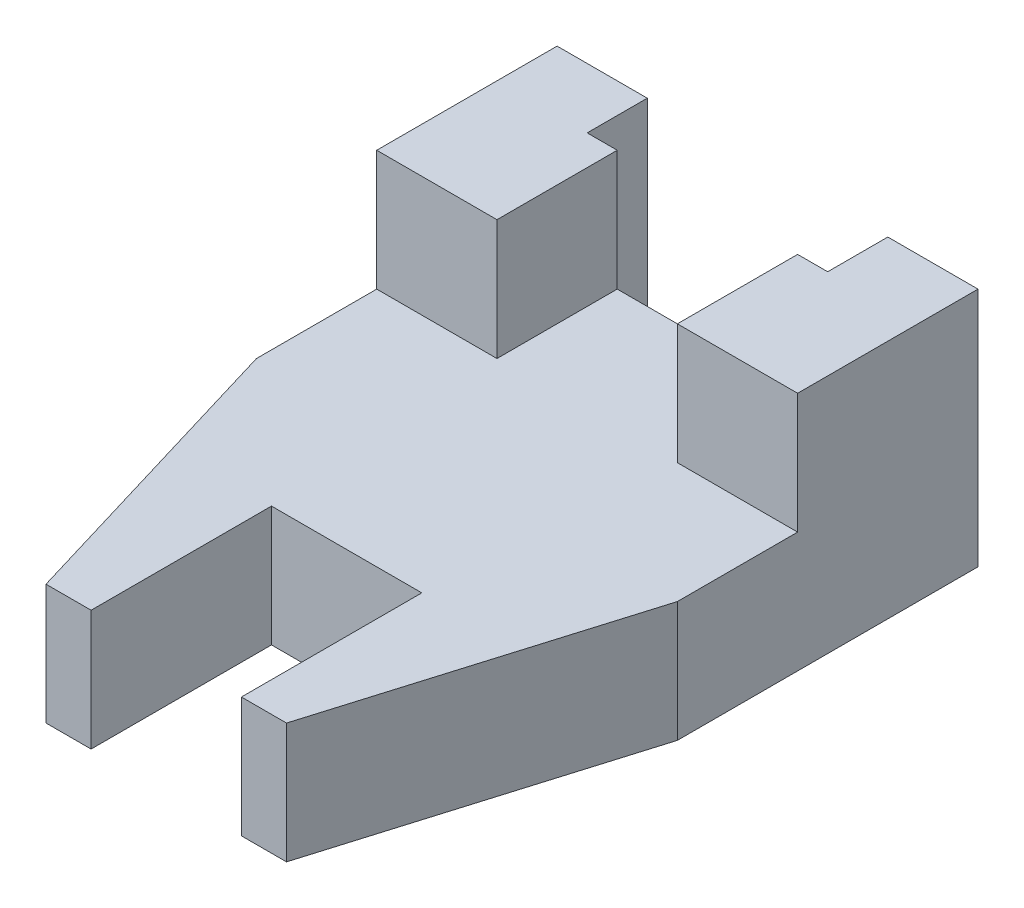
ISO-10303-21;
HEADER;
FILE_DESCRIPTION(('STEP AP214'),'2;1');
FILE_NAME('part.step','',(''),(''),'','','');
FILE_SCHEMA(('AUTOMOTIVE_DESIGN { 1 0 10303 214 1 1 1 1 }'));
ENDSEC;
DATA;
#1=APPLICATION_CONTEXT('core data for automotive mechanical design processes');
#2=APPLICATION_PROTOCOL_DEFINITION('international standard','automotive_design',2000,#1);
#3=PRODUCT_CONTEXT('',#1,'mechanical');
#4=PRODUCT('Part','Part','',(#3));
#5=PRODUCT_RELATED_PRODUCT_CATEGORY('part','',(#4));
#6=PRODUCT_DEFINITION_FORMATION('','',#4);
#7=PRODUCT_DEFINITION_CONTEXT('part definition',#1,'design');
#8=PRODUCT_DEFINITION('design','',#6,#7);
#9=PRODUCT_DEFINITION_SHAPE('','',#8);
#10=(LENGTH_UNIT() NAMED_UNIT(*) SI_UNIT(.MILLI.,.METRE.));
#11=(NAMED_UNIT(*) PLANE_ANGLE_UNIT() SI_UNIT($,.RADIAN.));
#12=(NAMED_UNIT(*) SI_UNIT($,.STERADIAN.) SOLID_ANGLE_UNIT());
#13=UNCERTAINTY_MEASURE_WITH_UNIT(LENGTH_MEASURE(1.E-05),#10,'distance_accuracy_value','');
#14=(GEOMETRIC_REPRESENTATION_CONTEXT(3) GLOBAL_UNCERTAINTY_ASSIGNED_CONTEXT((#13)) GLOBAL_UNIT_ASSIGNED_CONTEXT((#10,
#11,#12)) REPRESENTATION_CONTEXT('',''));
#15=CARTESIAN_POINT('',(0.,0.,0.));
#16=DIRECTION('',(0.,0.,1.));
#17=DIRECTION('',(1.,0.,0.));
#18=AXIS2_PLACEMENT_3D('',#15,#16,#17);
#19=CARTESIAN_POINT('',(0.,20.,70.));
#20=DIRECTION('',(0.,0.,1.));
#21=DIRECTION('',(1.,0.,0.));
#22=AXIS2_PLACEMENT_3D('',#19,#20,#21);
#23=PLANE('',#22);
#24=DIRECTION('',(-1.,0.,0.));
#25=VECTOR('',#24,1.);
#26=CARTESIAN_POINT('',(0.,0.,70.));
#27=LINE('',#26,#25);
#28=CARTESIAN_POINT('',(47.5,0.,70.));
#29=VERTEX_POINT('',#28);
#30=CARTESIAN_POINT('',(22.5,0.,70.));
#31=VERTEX_POINT('',#30);
#32=EDGE_CURVE('E272',#29,#31,#27,.T.);
#33=ORIENTED_EDGE('',*,*,#32,.F.);
#34=DIRECTION('',(0.,-1.,0.));
#35=VECTOR('',#34,1.);
#36=CARTESIAN_POINT('',(47.5,20.,70.));
#37=LINE('',#36,#35);
#38=CARTESIAN_POINT('',(47.5,20.,70.));
#39=VERTEX_POINT('',#38);
#40=EDGE_CURVE('E11',#39,#29,#37,.T.);
#41=ORIENTED_EDGE('',*,*,#40,.F.);
#42=DIRECTION('',(-1.,0.,0.));
#43=VECTOR('',#42,1.);
#44=CARTESIAN_POINT('',(0.,20.,70.));
#45=LINE('',#44,#43);
#46=CARTESIAN_POINT('',(22.5,20.,70.));
#47=VERTEX_POINT('',#46);
#48=EDGE_CURVE('E273',#39,#47,#45,.T.);
#49=ORIENTED_EDGE('',*,*,#48,.T.);
#50=DIRECTION('',(0.,-1.,0.));
#51=VECTOR('',#50,1.);
#52=CARTESIAN_POINT('',(22.5,20.,70.));
#53=LINE('',#52,#51);
#54=EDGE_CURVE('E311',#47,#31,#53,.T.);
#55=ORIENTED_EDGE('',*,*,#54,.T.);
#56=EDGE_LOOP('',(#33,#41,#49,#55));
#57=FACE_BOUND('',#56,.T.);
#58=ADVANCED_FACE('F45',(#57),#23,.T.);
#59=CARTESIAN_POINT('',(47.5,20.,0.));
#60=DIRECTION('',(-1.,0.,0.));
#61=DIRECTION('',(0.,0.,1.));
#62=AXIS2_PLACEMENT_3D('',#59,#60,#61);
#63=PLANE('',#62);
#64=DIRECTION('',(0.,0.,-1.));
#65=VECTOR('',#64,1.);
#66=CARTESIAN_POINT('',(47.5,0.,0.));
#67=LINE('',#66,#65);
#68=CARTESIAN_POINT('',(47.5,0.,100.));
#69=VERTEX_POINT('',#68);
#70=EDGE_CURVE('E315',#69,#29,#67,.T.);
#71=ORIENTED_EDGE('',*,*,#70,.F.);
#72=DIRECTION('',(0.,-1.,0.));
#73=VECTOR('',#72,1.);
#74=CARTESIAN_POINT('',(47.5,20.,100.));
#75=LINE('',#74,#73);
#76=CARTESIAN_POINT('',(47.5,20.,100.));
#77=VERTEX_POINT('',#76);
#78=EDGE_CURVE('E53',#77,#69,#75,.T.);
#79=ORIENTED_EDGE('',*,*,#78,.F.);
#80=DIRECTION('',(0.,0.,-1.));
#81=VECTOR('',#80,1.);
#82=CARTESIAN_POINT('',(47.5,20.,0.));
#83=LINE('',#82,#81);
#84=EDGE_CURVE('E277',#77,#39,#83,.T.);
#85=ORIENTED_EDGE('',*,*,#84,.T.);
#86=ORIENTED_EDGE('',*,*,#40,.T.);
#87=EDGE_LOOP('',(#71,#79,#85,#86));
#88=FACE_BOUND('',#87,.T.);
#89=ADVANCED_FACE('F368',(#88),#63,.T.);
#90=CARTESIAN_POINT('',(0.,20.,100.));
#91=DIRECTION('',(0.,0.,1.));
#92=DIRECTION('',(1.,0.,0.));
#93=AXIS2_PLACEMENT_3D('',#90,#91,#92);
#94=PLANE('',#93);
#95=DIRECTION('',(-1.,0.,0.));
#96=VECTOR('',#95,1.);
#97=CARTESIAN_POINT('',(0.,0.,100.));
#98=LINE('',#97,#96);
#99=CARTESIAN_POINT('',(55.,0.,100.));
#100=VERTEX_POINT('',#99);
#101=EDGE_CURVE('E319',#100,#69,#98,.T.);
#102=ORIENTED_EDGE('',*,*,#101,.F.);
#103=DIRECTION('',(0.,-1.,0.));
#104=VECTOR('',#103,1.);
#105=CARTESIAN_POINT('',(55.,20.,100.));
#106=LINE('',#105,#104);
#107=CARTESIAN_POINT('',(55.,20.,100.));
#108=VERTEX_POINT('',#107);
#109=EDGE_CURVE('E358',#108,#100,#106,.T.);
#110=ORIENTED_EDGE('',*,*,#109,.F.);
#111=DIRECTION('',(-1.,0.,0.));
#112=VECTOR('',#111,1.);
#113=CARTESIAN_POINT('',(0.,20.,100.));
#114=LINE('',#113,#112);
#115=EDGE_CURVE('E282',#108,#77,#114,.T.);
#116=ORIENTED_EDGE('',*,*,#115,.T.);
#117=ORIENTED_EDGE('',*,*,#78,.T.);
#118=EDGE_LOOP('',(#102,#110,#116,#117));
#119=FACE_BOUND('',#118,.T.);
#120=ADVANCED_FACE('F364',(#119),#94,.T.);
#121=CARTESIAN_POINT('',(77.9816513761468,20.,23.394495412844));
#122=DIRECTION('',(0.957826285221151,0.,0.287347885566345));
#123=DIRECTION('',(0.287347885566345,0.,-0.957826285221151));
#124=AXIS2_PLACEMENT_3D('',#121,#122,#123);
#125=PLANE('',#124);
#126=DIRECTION('',(-0.287347885566345,0.,0.957826285221151));
#127=VECTOR('',#126,1.);
#128=CARTESIAN_POINT('',(77.9816513761468,0.,23.394495412844));
#129=LINE('',#128,#127);
#130=CARTESIAN_POINT('',(70.,0.,50.));
#131=VERTEX_POINT('',#130);
#132=EDGE_CURVE('E323',#131,#100,#129,.T.);
#133=ORIENTED_EDGE('',*,*,#132,.F.);
#134=DIRECTION('',(0.,-1.,0.));
#135=VECTOR('',#134,1.);
#136=CARTESIAN_POINT('',(70.,20.,50.));
#137=LINE('',#136,#135);
#138=CARTESIAN_POINT('',(70.,20.,50.));
#139=VERTEX_POINT('',#138);
#140=EDGE_CURVE('E355',#139,#131,#137,.T.);
#141=ORIENTED_EDGE('',*,*,#140,.F.);
#142=DIRECTION('',(-0.287347885566345,0.,0.957826285221151));
#143=VECTOR('',#142,1.);
#144=CARTESIAN_POINT('',(77.9816513761468,20.,23.394495412844));
#145=LINE('',#144,#143);
#146=EDGE_CURVE('E286',#139,#108,#145,.T.);
#147=ORIENTED_EDGE('',*,*,#146,.T.);
#148=ORIENTED_EDGE('',*,*,#109,.T.);
#149=EDGE_LOOP('',(#133,#141,#147,#148));
#150=FACE_BOUND('',#149,.T.);
#151=ADVANCED_FACE('F374',(#150),#125,.T.);
#152=CARTESIAN_POINT('',(70.,20.,0.));
#153=DIRECTION('',(1.,0.,0.));
#154=DIRECTION('',(0.,0.,-1.));
#155=AXIS2_PLACEMENT_3D('',#152,#153,#154);
#156=PLANE('',#155);
#157=DIRECTION('',(0.,0.,1.));
#158=VECTOR('',#157,1.);
#159=CARTESIAN_POINT('',(70.,0.,0.));
#160=LINE('',#159,#158);
#161=CARTESIAN_POINT('',(70.,0.,0.));
#162=VERTEX_POINT('',#161);
#163=EDGE_CURVE('E208',#162,#131,#160,.T.);
#164=ORIENTED_EDGE('',*,*,#163,.F.);
#165=DIRECTION('',(0.,-1.,0.));
#166=VECTOR('',#165,1.);
#167=CARTESIAN_POINT('',(70.,40.,0.));
#168=LINE('',#167,#166);
#169=CARTESIAN_POINT('',(70.,40.,0.));
#170=VERTEX_POINT('',#169);
#171=EDGE_CURVE('E187',#170,#162,#168,.T.);
#172=ORIENTED_EDGE('',*,*,#171,.F.);
#173=DIRECTION('',(0.,0.,-1.));
#174=VECTOR('',#173,1.);
#175=CARTESIAN_POINT('',(70.,40.,0.));
#176=LINE('',#175,#174);
#177=CARTESIAN_POINT('',(70.,40.,30.));
#178=VERTEX_POINT('',#177);
#179=EDGE_CURVE('E194',#178,#170,#176,.T.);
#180=ORIENTED_EDGE('',*,*,#179,.F.);
#181=DIRECTION('',(0.,-1.,0.));
#182=VECTOR('',#181,1.);
#183=CARTESIAN_POINT('',(70.,40.,30.));
#184=LINE('',#183,#182);
#185=CARTESIAN_POINT('',(70.,20.,30.));
#186=VERTEX_POINT('',#185);
#187=EDGE_CURVE('E429',#178,#186,#184,.T.);
#188=ORIENTED_EDGE('',*,*,#187,.T.);
#189=DIRECTION('',(0.,0.,1.));
#190=VECTOR('',#189,1.);
#191=CARTESIAN_POINT('',(70.,20.,0.));
#192=LINE('',#191,#190);
#193=EDGE_CURVE('E290',#186,#139,#192,.T.);
#194=ORIENTED_EDGE('',*,*,#193,.T.);
#195=ORIENTED_EDGE('',*,*,#140,.T.);
#196=EDGE_LOOP('',(#164,#172,#180,#188,#194,#195));
#197=FACE_BOUND('',#196,.T.);
#198=ADVANCED_FACE('F206',(#197),#156,.T.);
#199=CARTESIAN_POINT('',(0.,20.,0.));
#200=DIRECTION('',(1.,0.,0.));
#201=DIRECTION('',(0.,0.,-1.));
#202=AXIS2_PLACEMENT_3D('',#199,#200,#201);
#203=PLANE('',#202);
#204=DIRECTION('',(0.,0.,1.));
#205=VECTOR('',#204,1.);
#206=CARTESIAN_POINT('',(0.,0.,0.));
#207=LINE('',#206,#205);
#208=CARTESIAN_POINT('',(0.,0.,0.));
#209=VERTEX_POINT('',#208);
#210=CARTESIAN_POINT('',(0.,0.,50.));
#211=VERTEX_POINT('',#210);
#212=EDGE_CURVE('E329',#209,#211,#207,.T.);
#213=ORIENTED_EDGE('',*,*,#212,.T.);
#214=DIRECTION('',(0.,-1.,0.));
#215=VECTOR('',#214,1.);
#216=CARTESIAN_POINT('',(0.,20.,50.));
#217=LINE('',#216,#215);
#218=CARTESIAN_POINT('',(0.,20.,50.));
#219=VERTEX_POINT('',#218);
#220=EDGE_CURVE('E351',#219,#211,#217,.T.);
#221=ORIENTED_EDGE('',*,*,#220,.F.);
#222=DIRECTION('',(0.,0.,1.));
#223=VECTOR('',#222,1.);
#224=CARTESIAN_POINT('',(0.,20.,0.));
#225=LINE('',#224,#223);
#226=CARTESIAN_POINT('',(0.,20.,30.));
#227=VERTEX_POINT('',#226);
#228=EDGE_CURVE('E299',#227,#219,#225,.T.);
#229=ORIENTED_EDGE('',*,*,#228,.F.);
#230=DIRECTION('',(0.,-1.,0.));
#231=VECTOR('',#230,1.);
#232=CARTESIAN_POINT('',(0.,40.,30.));
#233=LINE('',#232,#231);
#234=CARTESIAN_POINT('',(0.,40.,30.));
#235=VERTEX_POINT('',#234);
#236=EDGE_CURVE('E268',#235,#227,#233,.T.);
#237=ORIENTED_EDGE('',*,*,#236,.F.);
#238=DIRECTION('',(0.,0.,-1.));
#239=VECTOR('',#238,1.);
#240=CARTESIAN_POINT('',(0.,40.,0.));
#241=LINE('',#240,#239);
#242=CARTESIAN_POINT('',(0.,40.,0.));
#243=VERTEX_POINT('',#242);
#244=EDGE_CURVE('E221',#235,#243,#241,.T.);
#245=ORIENTED_EDGE('',*,*,#244,.T.);
#246=DIRECTION('',(0.,-1.,0.));
#247=VECTOR('',#246,1.);
#248=CARTESIAN_POINT('',(0.,40.,0.));
#249=LINE('',#248,#247);
#250=EDGE_CURVE('E245',#243,#209,#249,.T.);
#251=ORIENTED_EDGE('',*,*,#250,.T.);
#252=EDGE_LOOP('',(#213,#221,#229,#237,#245,#251));
#253=FACE_BOUND('',#252,.T.);
#254=ADVANCED_FACE('F398',(#253),#203,.F.);
#255=CARTESIAN_POINT('',(-13.7614678899083,20.,4.12844036697249));
#256=DIRECTION('',(0.957826285221151,0.,-0.287347885566346));
#257=DIRECTION('',(-0.287347885566346,0.,-0.957826285221151));
#258=AXIS2_PLACEMENT_3D('',#255,#256,#257);
#259=PLANE('',#258);
#260=DIRECTION('',(0.287347885566346,0.,0.957826285221151));
#261=VECTOR('',#260,1.);
#262=CARTESIAN_POINT('',(-13.7614678899083,0.,4.12844036697249));
#263=LINE('',#262,#261);
#264=CARTESIAN_POINT('',(15.,0.,100.));
#265=VERTEX_POINT('',#264);
#266=EDGE_CURVE('E332',#211,#265,#263,.T.);
#267=ORIENTED_EDGE('',*,*,#266,.T.);
#268=DIRECTION('',(0.,-1.,0.));
#269=VECTOR('',#268,1.);
#270=CARTESIAN_POINT('',(15.,20.,100.));
#271=LINE('',#270,#269);
#272=CARTESIAN_POINT('',(15.,20.,100.));
#273=VERTEX_POINT('',#272);
#274=EDGE_CURVE('E347',#273,#265,#271,.T.);
#275=ORIENTED_EDGE('',*,*,#274,.F.);
#276=DIRECTION('',(0.287347885566346,0.,0.957826285221151));
#277=VECTOR('',#276,1.);
#278=CARTESIAN_POINT('',(-13.7614678899083,20.,4.12844036697249));
#279=LINE('',#278,#277);
#280=EDGE_CURVE('E302',#219,#273,#279,.T.);
#281=ORIENTED_EDGE('',*,*,#280,.F.);
#282=ORIENTED_EDGE('',*,*,#220,.T.);
#283=EDGE_LOOP('',(#267,#275,#281,#282));
#284=FACE_BOUND('',#283,.T.);
#285=ADVANCED_FACE('F394',(#284),#259,.F.);
#286=CARTESIAN_POINT('',(0.,20.,100.));
#287=DIRECTION('',(0.,0.,-1.));
#288=DIRECTION('',(-1.,0.,0.));
#289=AXIS2_PLACEMENT_3D('',#286,#287,#288);
#290=PLANE('',#289);
#291=DIRECTION('',(1.,0.,0.));
#292=VECTOR('',#291,1.);
#293=CARTESIAN_POINT('',(0.,0.,100.));
#294=LINE('',#293,#292);
#295=CARTESIAN_POINT('',(22.5,0.,100.));
#296=VERTEX_POINT('',#295);
#297=EDGE_CURVE('E335',#265,#296,#294,.T.);
#298=ORIENTED_EDGE('',*,*,#297,.T.);
#299=DIRECTION('',(0.,-1.,0.));
#300=VECTOR('',#299,1.);
#301=CARTESIAN_POINT('',(22.5,20.,100.));
#302=LINE('',#301,#300);
#303=CARTESIAN_POINT('',(22.5,20.,100.));
#304=VERTEX_POINT('',#303);
#305=EDGE_CURVE('E343',#304,#296,#302,.T.);
#306=ORIENTED_EDGE('',*,*,#305,.F.);
#307=DIRECTION('',(1.,0.,0.));
#308=VECTOR('',#307,1.);
#309=CARTESIAN_POINT('',(0.,20.,100.));
#310=LINE('',#309,#308);
#311=EDGE_CURVE('E305',#273,#304,#310,.T.);
#312=ORIENTED_EDGE('',*,*,#311,.F.);
#313=ORIENTED_EDGE('',*,*,#274,.T.);
#314=EDGE_LOOP('',(#298,#306,#312,#313));
#315=FACE_BOUND('',#314,.T.);
#316=ADVANCED_FACE('F390',(#315),#290,.F.);
#317=CARTESIAN_POINT('',(22.5,20.,0.));
#318=DIRECTION('',(-1.,0.,0.));
#319=DIRECTION('',(0.,0.,1.));
#320=AXIS2_PLACEMENT_3D('',#317,#318,#319);
#321=PLANE('',#320);
#322=DIRECTION('',(0.,0.,-1.));
#323=VECTOR('',#322,1.);
#324=CARTESIAN_POINT('',(22.5,0.,0.));
#325=LINE('',#324,#323);
#326=EDGE_CURVE('E278',#296,#31,#325,.T.);
#327=ORIENTED_EDGE('',*,*,#326,.T.);
#328=ORIENTED_EDGE('',*,*,#54,.F.);
#329=DIRECTION('',(0.,0.,-1.));
#330=VECTOR('',#329,1.);
#331=CARTESIAN_POINT('',(22.5,20.,0.));
#332=LINE('',#331,#330);
#333=EDGE_CURVE('E308',#304,#47,#332,.T.);
#334=ORIENTED_EDGE('',*,*,#333,.F.);
#335=ORIENTED_EDGE('',*,*,#305,.T.);
#336=EDGE_LOOP('',(#327,#328,#334,#335));
#337=FACE_BOUND('',#336,.T.);
#338=ADVANCED_FACE('F386',(#337),#321,.F.);
#339=CARTESIAN_POINT('',(0.,20.,0.));
#340=DIRECTION('',(0.,1.,0.));
#341=DIRECTION('',(0.,0.,1.));
#342=AXIS2_PLACEMENT_3D('',#339,#340,#341);
#343=PLANE('',#342);
#344=ORIENTED_EDGE('',*,*,#48,.F.);
#345=ORIENTED_EDGE('',*,*,#84,.F.);
#346=ORIENTED_EDGE('',*,*,#115,.F.);
#347=ORIENTED_EDGE('',*,*,#146,.F.);
#348=ORIENTED_EDGE('',*,*,#193,.F.);
#349=DIRECTION('',(-1.,0.,0.));
#350=VECTOR('',#349,1.);
#351=CARTESIAN_POINT('',(0.,20.,30.));
#352=LINE('',#351,#350);
#353=CARTESIAN_POINT('',(50.,20.,30.));
#354=VERTEX_POINT('',#353);
#355=EDGE_CURVE('E295',#186,#354,#352,.T.);
#356=ORIENTED_EDGE('',*,*,#355,.T.);
#357=DIRECTION('',(0.,0.,1.));
#358=VECTOR('',#357,1.);
#359=CARTESIAN_POINT('',(50.,20.,0.));
#360=LINE('',#359,#358);
#361=CARTESIAN_POINT('',(50.,20.,10.));
#362=VERTEX_POINT('',#361);
#363=EDGE_CURVE('E449',#362,#354,#360,.T.);
#364=ORIENTED_EDGE('',*,*,#363,.F.);
#365=DIRECTION('',(1.,0.,0.));
#366=VECTOR('',#365,1.);
#367=CARTESIAN_POINT('',(0.,20.,10.));
#368=LINE('',#367,#366);
#369=CARTESIAN_POINT('',(20.,20.,10.));
#370=VERTEX_POINT('',#369);
#371=EDGE_CURVE('E445',#370,#362,#368,.T.);
#372=ORIENTED_EDGE('',*,*,#371,.F.);
#373=DIRECTION('',(0.,0.,1.));
#374=VECTOR('',#373,1.);
#375=CARTESIAN_POINT('',(20.,20.,0.));
#376=LINE('',#375,#374);
#377=CARTESIAN_POINT('',(20.,20.,30.));
#378=VERTEX_POINT('',#377);
#379=EDGE_CURVE('E60',#370,#378,#376,.T.);
#380=ORIENTED_EDGE('',*,*,#379,.T.);
#381=EDGE_CURVE('E294',#378,#227,#352,.T.);
#382=ORIENTED_EDGE('',*,*,#381,.T.);
#383=ORIENTED_EDGE('',*,*,#228,.T.);
#384=ORIENTED_EDGE('',*,*,#280,.T.);
#385=ORIENTED_EDGE('',*,*,#311,.T.);
#386=ORIENTED_EDGE('',*,*,#333,.T.);
#387=EDGE_LOOP('',(#344,#345,#346,#347,#348,#356,#364,#372,#380,#382,#383,#384,#385,#386));
#388=FACE_BOUND('',#387,.T.);
#389=ADVANCED_FACE('F378',(#388),#343,.T.);
#390=CARTESIAN_POINT('',(0.,0.,0.));
#391=DIRECTION('',(0.,1.,0.));
#392=DIRECTION('',(0.,0.,1.));
#393=AXIS2_PLACEMENT_3D('',#390,#391,#392);
#394=PLANE('',#393);
#395=ORIENTED_EDGE('',*,*,#32,.T.);
#396=ORIENTED_EDGE('',*,*,#326,.F.);
#397=ORIENTED_EDGE('',*,*,#297,.F.);
#398=ORIENTED_EDGE('',*,*,#266,.F.);
#399=ORIENTED_EDGE('',*,*,#212,.F.);
#400=DIRECTION('',(1.,0.,0.));
#401=VECTOR('',#400,1.);
#402=CARTESIAN_POINT('',(0.,0.,0.));
#403=LINE('',#402,#401);
#404=CARTESIAN_POINT('',(15.,0.,0.));
#405=VERTEX_POINT('',#404);
#406=EDGE_CURVE('E226',#209,#405,#403,.T.);
#407=ORIENTED_EDGE('',*,*,#406,.T.);
#408=DIRECTION('',(0.,0.,1.));
#409=VECTOR('',#408,1.);
#410=CARTESIAN_POINT('',(15.,0.,-1.48318857196017E-13));
#411=LINE('',#410,#409);
#412=CARTESIAN_POINT('',(15.0000000000001,0.,10.));
#413=VERTEX_POINT('',#412);
#414=EDGE_CURVE('E215',#405,#413,#411,.T.);
#415=ORIENTED_EDGE('',*,*,#414,.T.);
#416=DIRECTION('',(1.,0.,0.));
#417=VECTOR('',#416,1.);
#418=CARTESIAN_POINT('',(0.,0.,9.99999999999999));
#419=LINE('',#418,#417);
#420=CARTESIAN_POINT('',(54.9999999999999,0.,9.99999999999999));
#421=VERTEX_POINT('',#420);
#422=EDGE_CURVE('E211',#413,#421,#419,.T.);
#423=ORIENTED_EDGE('',*,*,#422,.T.);
#424=DIRECTION('',(0.,0.,1.));
#425=VECTOR('',#424,1.);
#426=CARTESIAN_POINT('',(55.,0.,5.34294830600857E-13));
#427=LINE('',#426,#425);
#428=CARTESIAN_POINT('',(55.,0.,0.));
#429=VERTEX_POINT('',#428);
#430=EDGE_CURVE('E204',#429,#421,#427,.T.);
#431=ORIENTED_EDGE('',*,*,#430,.F.);
#432=DIRECTION('',(-1.,0.,0.));
#433=VECTOR('',#432,1.);
#434=CARTESIAN_POINT('',(0.,0.,0.));
#435=LINE('',#434,#433);
#436=EDGE_CURVE('E417',#162,#429,#435,.T.);
#437=ORIENTED_EDGE('',*,*,#436,.F.);
#438=ORIENTED_EDGE('',*,*,#163,.T.);
#439=ORIENTED_EDGE('',*,*,#132,.T.);
#440=ORIENTED_EDGE('',*,*,#101,.T.);
#441=ORIENTED_EDGE('',*,*,#70,.T.);
#442=EDGE_LOOP('',(#395,#396,#397,#398,#399,#407,#415,#423,#431,#437,#438,#439,#440,#441));
#443=FACE_BOUND('',#442,.T.);
#444=ADVANCED_FACE('F371',(#443),#394,.F.);
#445=CARTESIAN_POINT('',(0.,40.,30.));
#446=DIRECTION('',(0.,0.,1.));
#447=DIRECTION('',(1.,0.,0.));
#448=AXIS2_PLACEMENT_3D('',#445,#446,#447);
#449=PLANE('',#448);
#450=ORIENTED_EDGE('',*,*,#381,.F.);
#451=DIRECTION('',(0.,-1.,0.));
#452=VECTOR('',#451,1.);
#453=CARTESIAN_POINT('',(20.,40.,30.));
#454=LINE('',#453,#452);
#455=CARTESIAN_POINT('',(20.,40.,30.));
#456=VERTEX_POINT('',#455);
#457=EDGE_CURVE('E265',#456,#378,#454,.T.);
#458=ORIENTED_EDGE('',*,*,#457,.F.);
#459=DIRECTION('',(-1.,0.,0.));
#460=VECTOR('',#459,1.);
#461=CARTESIAN_POINT('',(0.,40.,30.));
#462=LINE('',#461,#460);
#463=EDGE_CURVE('E225',#456,#235,#462,.T.);
#464=ORIENTED_EDGE('',*,*,#463,.T.);
#465=ORIENTED_EDGE('',*,*,#236,.T.);
#466=EDGE_LOOP('',(#450,#458,#464,#465));
#467=FACE_BOUND('',#466,.T.);
#468=ADVANCED_FACE('F488',(#467),#449,.T.);
#469=CARTESIAN_POINT('',(20.,40.,0.));
#470=DIRECTION('',(1.,0.,0.));
#471=DIRECTION('',(0.,0.,-1.));
#472=AXIS2_PLACEMENT_3D('',#469,#470,#471);
#473=PLANE('',#472);
#474=ORIENTED_EDGE('',*,*,#379,.F.);
#475=DIRECTION('',(0.,-1.,0.));
#476=VECTOR('',#475,1.);
#477=CARTESIAN_POINT('',(20.,40.,10.));
#478=LINE('',#477,#476);
#479=CARTESIAN_POINT('',(20.,40.,10.));
#480=VERTEX_POINT('',#479);
#481=EDGE_CURVE('E262',#480,#370,#478,.T.);
#482=ORIENTED_EDGE('',*,*,#481,.F.);
#483=DIRECTION('',(0.,0.,1.));
#484=VECTOR('',#483,1.);
#485=CARTESIAN_POINT('',(20.,40.,0.));
#486=LINE('',#485,#484);
#487=EDGE_CURVE('E230',#480,#456,#486,.T.);
#488=ORIENTED_EDGE('',*,*,#487,.T.);
#489=ORIENTED_EDGE('',*,*,#457,.T.);
#490=EDGE_LOOP('',(#474,#482,#488,#489));
#491=FACE_BOUND('',#490,.T.);
#492=ADVANCED_FACE('F493',(#491),#473,.T.);
#493=CARTESIAN_POINT('',(0.,40.,9.99999999999999));
#494=DIRECTION('',(0.,0.,-1.));
#495=DIRECTION('',(-1.,0.,0.));
#496=AXIS2_PLACEMENT_3D('',#493,#494,#495);
#497=PLANE('',#496);
#498=ORIENTED_EDGE('',*,*,#422,.F.);
#499=DIRECTION('',(0.,-1.,0.));
#500=VECTOR('',#499,1.);
#501=CARTESIAN_POINT('',(15.0000000000001,40.,10.));
#502=LINE('',#501,#500);
#503=CARTESIAN_POINT('',(15.0000000000001,40.,10.));
#504=VERTEX_POINT('',#503);
#505=EDGE_CURVE('E259',#504,#413,#502,.T.);
#506=ORIENTED_EDGE('',*,*,#505,.F.);
#507=DIRECTION('',(1.,0.,0.));
#508=VECTOR('',#507,1.);
#509=CARTESIAN_POINT('',(0.,40.,9.99999999999999));
#510=LINE('',#509,#508);
#511=EDGE_CURVE('E234',#504,#480,#510,.T.);
#512=ORIENTED_EDGE('',*,*,#511,.T.);
#513=ORIENTED_EDGE('',*,*,#481,.T.);
#514=ORIENTED_EDGE('',*,*,#371,.T.);
#515=DIRECTION('',(0.,-1.,0.));
#516=VECTOR('',#515,1.);
#517=CARTESIAN_POINT('',(50.,40.,10.));
#518=LINE('',#517,#516);
#519=CARTESIAN_POINT('',(50.,40.,10.));
#520=VERTEX_POINT('',#519);
#521=EDGE_CURVE('E68',#520,#362,#518,.T.);
#522=ORIENTED_EDGE('',*,*,#521,.F.);
#523=DIRECTION('',(-1.,0.,0.));
#524=VECTOR('',#523,1.);
#525=CARTESIAN_POINT('',(0.,40.,10.));
#526=LINE('',#525,#524);
#527=CARTESIAN_POINT('',(54.9999999999999,40.,9.99999999999999));
#528=VERTEX_POINT('',#527);
#529=EDGE_CURVE('E420',#528,#520,#526,.T.);
#530=ORIENTED_EDGE('',*,*,#529,.F.);
#531=DIRECTION('',(0.,-1.,0.));
#532=VECTOR('',#531,1.);
#533=CARTESIAN_POINT('',(54.9999999999999,40.,9.99999999999999));
#534=LINE('',#533,#532);
#535=EDGE_CURVE('E217',#528,#421,#534,.T.);
#536=ORIENTED_EDGE('',*,*,#535,.T.);
#537=EDGE_LOOP('',(#498,#506,#512,#513,#514,#522,#530,#536));
#538=FACE_BOUND('',#537,.T.);
#539=ADVANCED_FACE('F419',(#538),#497,.T.);
#540=CARTESIAN_POINT('',(15.,40.,-1.48318857196017E-13));
#541=DIRECTION('',(1.,0.,0.));
#542=DIRECTION('',(0.,0.,-1.));
#543=AXIS2_PLACEMENT_3D('',#540,#541,#542);
#544=PLANE('',#543);
#545=ORIENTED_EDGE('',*,*,#414,.F.);
#546=DIRECTION('',(0.,-1.,0.));
#547=VECTOR('',#546,1.);
#548=CARTESIAN_POINT('',(15.,40.,0.));
#549=LINE('',#548,#547);
#550=CARTESIAN_POINT('',(15.,40.,0.));
#551=VERTEX_POINT('',#550);
#552=EDGE_CURVE('E256',#551,#405,#549,.T.);
#553=ORIENTED_EDGE('',*,*,#552,.F.);
#554=DIRECTION('',(0.,0.,1.));
#555=VECTOR('',#554,1.);
#556=CARTESIAN_POINT('',(15.,40.,-1.48318857196017E-13));
#557=LINE('',#556,#555);
#558=EDGE_CURVE('E238',#551,#504,#557,.T.);
#559=ORIENTED_EDGE('',*,*,#558,.T.);
#560=ORIENTED_EDGE('',*,*,#505,.T.);
#561=EDGE_LOOP('',(#545,#553,#559,#560));
#562=FACE_BOUND('',#561,.T.);
#563=ADVANCED_FACE('F406',(#562),#544,.T.);
#564=CARTESIAN_POINT('',(0.,40.,0.));
#565=DIRECTION('',(0.,0.,-1.));
#566=DIRECTION('',(-1.,0.,0.));
#567=AXIS2_PLACEMENT_3D('',#564,#565,#566);
#568=PLANE('',#567);
#569=ORIENTED_EDGE('',*,*,#406,.F.);
#570=ORIENTED_EDGE('',*,*,#250,.F.);
#571=DIRECTION('',(1.,0.,0.));
#572=VECTOR('',#571,1.);
#573=CARTESIAN_POINT('',(0.,40.,0.));
#574=LINE('',#573,#572);
#575=EDGE_CURVE('E242',#243,#551,#574,.T.);
#576=ORIENTED_EDGE('',*,*,#575,.T.);
#577=ORIENTED_EDGE('',*,*,#552,.T.);
#578=EDGE_LOOP('',(#569,#570,#576,#577));
#579=FACE_BOUND('',#578,.T.);
#580=ADVANCED_FACE('F402',(#579),#568,.T.);
#581=CARTESIAN_POINT('',(0.,40.,0.));
#582=DIRECTION('',(0.,1.,0.));
#583=DIRECTION('',(0.,0.,1.));
#584=AXIS2_PLACEMENT_3D('',#581,#582,#583);
#585=PLANE('',#584);
#586=ORIENTED_EDGE('',*,*,#244,.F.);
#587=ORIENTED_EDGE('',*,*,#463,.F.);
#588=ORIENTED_EDGE('',*,*,#487,.F.);
#589=ORIENTED_EDGE('',*,*,#511,.F.);
#590=ORIENTED_EDGE('',*,*,#558,.F.);
#591=ORIENTED_EDGE('',*,*,#575,.F.);
#592=EDGE_LOOP('',(#586,#587,#588,#589,#590,#591));
#593=FACE_BOUND('',#592,.T.);
#594=ADVANCED_FACE('F503',(#593),#585,.T.);
#595=CARTESIAN_POINT('',(0.,40.,0.));
#596=DIRECTION('',(0.,0.,1.));
#597=DIRECTION('',(1.,0.,0.));
#598=AXIS2_PLACEMENT_3D('',#595,#596,#597);
#599=PLANE('',#598);
#600=ORIENTED_EDGE('',*,*,#436,.T.);
#601=DIRECTION('',(0.,-1.,0.));
#602=VECTOR('',#601,1.);
#603=CARTESIAN_POINT('',(55.,40.,0.));
#604=LINE('',#603,#602);
#605=CARTESIAN_POINT('',(55.,40.,0.));
#606=VERTEX_POINT('',#605);
#607=EDGE_CURVE('E189',#606,#429,#604,.T.);
#608=ORIENTED_EDGE('',*,*,#607,.F.);
#609=DIRECTION('',(-1.,0.,0.));
#610=VECTOR('',#609,1.);
#611=CARTESIAN_POINT('',(0.,40.,0.));
#612=LINE('',#611,#610);
#613=EDGE_CURVE('E183',#170,#606,#612,.T.);
#614=ORIENTED_EDGE('',*,*,#613,.F.);
#615=ORIENTED_EDGE('',*,*,#171,.T.);
#616=EDGE_LOOP('',(#600,#608,#614,#615));
#617=FACE_BOUND('',#616,.T.);
#618=ADVANCED_FACE('F185',(#617),#599,.F.);
#619=CARTESIAN_POINT('',(55.,40.,5.34294830600857E-13));
#620=DIRECTION('',(1.,0.,0.));
#621=DIRECTION('',(0.,0.,-1.));
#622=AXIS2_PLACEMENT_3D('',#619,#620,#621);
#623=PLANE('',#622);
#624=ORIENTED_EDGE('',*,*,#430,.T.);
#625=ORIENTED_EDGE('',*,*,#535,.F.);
#626=DIRECTION('',(0.,0.,1.));
#627=VECTOR('',#626,1.);
#628=CARTESIAN_POINT('',(55.,40.,5.34294830600857E-13));
#629=LINE('',#628,#627);
#630=EDGE_CURVE('E193',#606,#528,#629,.T.);
#631=ORIENTED_EDGE('',*,*,#630,.F.);
#632=ORIENTED_EDGE('',*,*,#607,.T.);
#633=EDGE_LOOP('',(#624,#625,#631,#632));
#634=FACE_BOUND('',#633,.T.);
#635=ADVANCED_FACE('F414',(#634),#623,.F.);
#636=CARTESIAN_POINT('',(50.,40.,0.));
#637=DIRECTION('',(1.,0.,0.));
#638=DIRECTION('',(0.,0.,-1.));
#639=AXIS2_PLACEMENT_3D('',#636,#637,#638);
#640=PLANE('',#639);
#641=ORIENTED_EDGE('',*,*,#521,.T.);
#642=ORIENTED_EDGE('',*,*,#363,.T.);
#643=DIRECTION('',(0.,-1.,0.));
#644=VECTOR('',#643,1.);
#645=CARTESIAN_POINT('',(50.,40.,30.));
#646=LINE('',#645,#644);
#647=CARTESIAN_POINT('',(50.,40.,30.));
#648=VERTEX_POINT('',#647);
#649=EDGE_CURVE('E423',#648,#354,#646,.T.);
#650=ORIENTED_EDGE('',*,*,#649,.F.);
#651=DIRECTION('',(0.,0.,1.));
#652=VECTOR('',#651,1.);
#653=CARTESIAN_POINT('',(50.,40.,0.));
#654=LINE('',#653,#652);
#655=EDGE_CURVE('E436',#520,#648,#654,.T.);
#656=ORIENTED_EDGE('',*,*,#655,.F.);
#657=EDGE_LOOP('',(#641,#642,#650,#656));
#658=FACE_BOUND('',#657,.T.);
#659=ADVANCED_FACE('F452',(#658),#640,.F.);
#660=CARTESIAN_POINT('',(0.,40.,30.));
#661=DIRECTION('',(0.,0.,-1.));
#662=DIRECTION('',(-1.,0.,0.));
#663=AXIS2_PLACEMENT_3D('',#660,#661,#662);
#664=PLANE('',#663);
#665=ORIENTED_EDGE('',*,*,#355,.F.);
#666=ORIENTED_EDGE('',*,*,#187,.F.);
#667=DIRECTION('',(1.,0.,0.));
#668=VECTOR('',#667,1.);
#669=CARTESIAN_POINT('',(0.,40.,30.));
#670=LINE('',#669,#668);
#671=EDGE_CURVE('E199',#648,#178,#670,.T.);
#672=ORIENTED_EDGE('',*,*,#671,.F.);
#673=ORIENTED_EDGE('',*,*,#649,.T.);
#674=EDGE_LOOP('',(#665,#666,#672,#673));
#675=FACE_BOUND('',#674,.T.);
#676=ADVANCED_FACE('F456',(#675),#664,.F.);
#677=CARTESIAN_POINT('',(0.,40.,0.));
#678=DIRECTION('',(0.,1.,0.));
#679=DIRECTION('',(0.,0.,1.));
#680=AXIS2_PLACEMENT_3D('',#677,#678,#679);
#681=PLANE('',#680);
#682=ORIENTED_EDGE('',*,*,#179,.T.);
#683=ORIENTED_EDGE('',*,*,#613,.T.);
#684=ORIENTED_EDGE('',*,*,#630,.T.);
#685=ORIENTED_EDGE('',*,*,#529,.T.);
#686=ORIENTED_EDGE('',*,*,#655,.T.);
#687=ORIENTED_EDGE('',*,*,#671,.T.);
#688=EDGE_LOOP('',(#682,#683,#684,#685,#686,#687));
#689=FACE_BOUND('',#688,.T.);
#690=ADVANCED_FACE('F197',(#689),#681,.T.);
#691=CLOSED_SHELL('',(#58,#89,#120,#151,#198,#254,#285,#316,#338,#389,#444,#468,#492,#539,#563,
#580,#594,#618,#635,#659,#676,#690));
#692=MANIFOLD_SOLID_BREP('B2',#691);
#693=ADVANCED_BREP_SHAPE_REPRESENTATION('',(#18,#692),#14);
#694=SHAPE_DEFINITION_REPRESENTATION(#9,#693);
ENDSEC;
END-ISO-10303-21;
